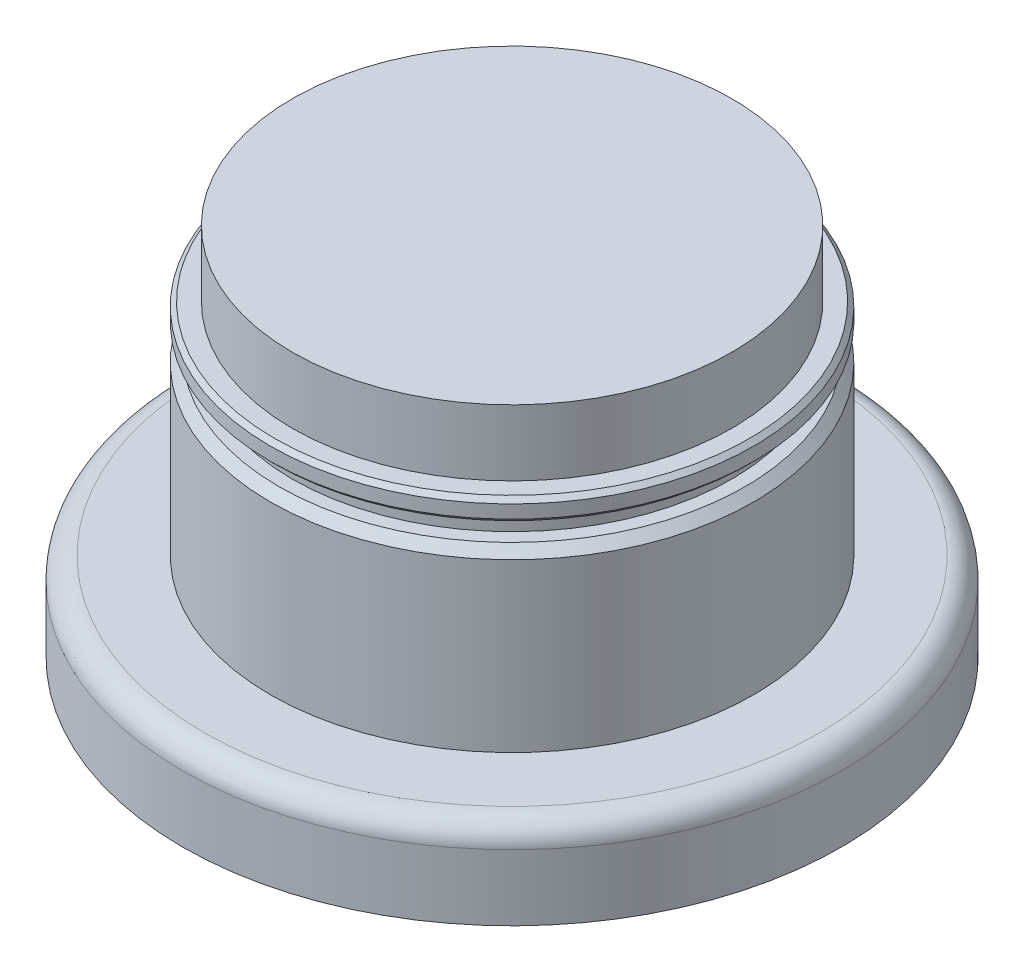
ISO-10303-21;
HEADER;
FILE_DESCRIPTION(('STEP AP214'),'2;1');
FILE_NAME('part.step','',(''),(''),'','','');
FILE_SCHEMA(('AUTOMOTIVE_DESIGN { 1 0 10303 214 1 1 1 1 }'));
ENDSEC;
DATA;
#1=APPLICATION_CONTEXT('core data for automotive mechanical design processes');
#2=APPLICATION_PROTOCOL_DEFINITION('international standard','automotive_design',2000,#1);
#3=PRODUCT_CONTEXT('',#1,'mechanical');
#4=PRODUCT('Part','Part','',(#3));
#5=PRODUCT_RELATED_PRODUCT_CATEGORY('part','',(#4));
#6=PRODUCT_DEFINITION_FORMATION('','',#4);
#7=PRODUCT_DEFINITION_CONTEXT('part definition',#1,'design');
#8=PRODUCT_DEFINITION('design','',#6,#7);
#9=PRODUCT_DEFINITION_SHAPE('','',#8);
#10=(LENGTH_UNIT() NAMED_UNIT(*) SI_UNIT(.MILLI.,.METRE.));
#11=(NAMED_UNIT(*) PLANE_ANGLE_UNIT() SI_UNIT($,.RADIAN.));
#12=(NAMED_UNIT(*) SI_UNIT($,.STERADIAN.) SOLID_ANGLE_UNIT());
#13=UNCERTAINTY_MEASURE_WITH_UNIT(LENGTH_MEASURE(1.E-05),#10,'distance_accuracy_value','');
#14=(GEOMETRIC_REPRESENTATION_CONTEXT(3) GLOBAL_UNCERTAINTY_ASSIGNED_CONTEXT((#13)) GLOBAL_UNIT_ASSIGNED_CONTEXT((#10,
#11,#12)) REPRESENTATION_CONTEXT('',''));
#15=CARTESIAN_POINT('',(0.,0.,0.));
#16=DIRECTION('',(0.,0.,1.));
#17=DIRECTION('',(1.,0.,0.));
#18=AXIS2_PLACEMENT_3D('',#15,#16,#17);
#19=CARTESIAN_POINT('',(0.,20.,0.));
#20=DIRECTION('',(0.,-1.,0.));
#21=DIRECTION('',(0.,0.,-1.));
#22=AXIS2_PLACEMENT_3D('',#19,#20,#21);
#23=CYLINDRICAL_SURFACE('',#22,75.);
#24=CARTESIAN_POINT('',(0.,15.,0.));
#25=DIRECTION('',(0.,1.,0.));
#26=DIRECTION('',(0.,0.,1.));
#27=AXIS2_PLACEMENT_3D('',#24,#25,#26);
#28=CIRCLE('',#27,75.);
#29=CARTESIAN_POINT('',(0.,15.,75.));
#30=VERTEX_POINT('',#29);
#31=EDGE_CURVE('E77',#30,#30,#28,.F.);
#32=ORIENTED_EDGE('',*,*,#31,.T.);
#33=EDGE_LOOP('',(#32));
#34=FACE_BOUND('',#33,.T.);
#35=CARTESIAN_POINT('',(0.,0.,0.));
#36=DIRECTION('',(0.,1.,0.));
#37=DIRECTION('',(0.,0.,1.));
#38=AXIS2_PLACEMENT_3D('',#35,#36,#37);
#39=CIRCLE('',#38,75.);
#40=CARTESIAN_POINT('',(0.,0.,75.));
#41=VERTEX_POINT('',#40);
#42=EDGE_CURVE('E86',#41,#41,#39,.T.);
#43=ORIENTED_EDGE('',*,*,#42,.T.);
#44=EDGE_LOOP('',(#43));
#45=FACE_BOUND('',#44,.T.);
#46=ADVANCED_FACE('F43',(#34,#45),#23,.T.);
#47=CARTESIAN_POINT('',(0.,20.,0.));
#48=DIRECTION('',(0.,1.,0.));
#49=DIRECTION('',(0.,0.,1.));
#50=AXIS2_PLACEMENT_3D('',#47,#48,#49);
#51=PLANE('',#50);
#52=CARTESIAN_POINT('',(0.,20.,0.));
#53=DIRECTION('',(0.,1.,0.));
#54=DIRECTION('',(0.,0.,1.));
#55=AXIS2_PLACEMENT_3D('',#52,#53,#54);
#56=CIRCLE('',#55,55.);
#57=CARTESIAN_POINT('',(0.,20.,55.));
#58=VERTEX_POINT('',#57);
#59=EDGE_CURVE('E90',#58,#58,#56,.T.);
#60=ORIENTED_EDGE('',*,*,#59,.F.);
#61=EDGE_LOOP('',(#60));
#62=FACE_BOUND('',#61,.T.);
#63=CARTESIAN_POINT('',(0.,20.,0.));
#64=DIRECTION('',(0.,1.,0.));
#65=DIRECTION('',(0.,0.,1.));
#66=AXIS2_PLACEMENT_3D('',#63,#64,#65);
#67=CIRCLE('',#66,70.);
#68=CARTESIAN_POINT('',(0.,20.,70.));
#69=VERTEX_POINT('',#68);
#70=EDGE_CURVE('E82',#69,#69,#67,.T.);
#71=ORIENTED_EDGE('',*,*,#70,.T.);
#72=EDGE_LOOP('',(#71));
#73=FACE_BOUND('',#72,.T.);
#74=ADVANCED_FACE('F133',(#62,#73),#51,.T.);
#75=CARTESIAN_POINT('',(0.,0.,0.));
#76=DIRECTION('',(0.,1.,0.));
#77=DIRECTION('',(0.,0.,1.));
#78=AXIS2_PLACEMENT_3D('',#75,#76,#77);
#79=PLANE('',#78);
#80=ORIENTED_EDGE('',*,*,#42,.F.);
#81=EDGE_LOOP('',(#80));
#82=FACE_BOUND('',#81,.T.);
#83=ADVANCED_FACE('F139',(#82),#79,.F.);
#84=CARTESIAN_POINT('',(0.,15.,0.));
#85=DIRECTION('',(0.,1.,0.));
#86=DIRECTION('',(0.,0.,1.));
#87=AXIS2_PLACEMENT_3D('',#84,#85,#86);
#88=TOROIDAL_SURFACE('',#87,70.,5.);
#89=ORIENTED_EDGE('',*,*,#31,.F.);
#90=EDGE_LOOP('',(#89));
#91=FACE_BOUND('',#90,.T.);
#92=ORIENTED_EDGE('',*,*,#70,.F.);
#93=EDGE_LOOP('',(#92));
#94=FACE_BOUND('',#93,.T.);
#95=ADVANCED_FACE('F145',(#91,#94),#88,.T.);
#96=CARTESIAN_POINT('',(0.,60.,0.));
#97=DIRECTION('',(0.,-1.,0.));
#98=DIRECTION('',(0.,0.,-1.));
#99=AXIS2_PLACEMENT_3D('',#96,#97,#98);
#100=CYLINDRICAL_SURFACE('',#99,55.);
#101=CARTESIAN_POINT('',(0.,58.,0.));
#102=DIRECTION('',(0.,1.,0.));
#103=DIRECTION('',(0.,0.,1.));
#104=AXIS2_PLACEMENT_3D('',#101,#102,#103);
#105=CIRCLE('',#104,55.);
#106=CARTESIAN_POINT('',(0.,58.,55.));
#107=VERTEX_POINT('',#106);
#108=EDGE_CURVE('E10',#107,#107,#105,.F.);
#109=ORIENTED_EDGE('',*,*,#108,.T.);
#110=EDGE_LOOP('',(#109));
#111=FACE_BOUND('',#110,.T.);
#112=ORIENTED_EDGE('',*,*,#59,.T.);
#113=EDGE_LOOP('',(#112));
#114=FACE_BOUND('',#113,.T.);
#115=ADVANCED_FACE('F148',(#111,#114),#100,.T.);
#116=CARTESIAN_POINT('',(0.,60.,0.));
#117=DIRECTION('',(0.,1.,0.));
#118=DIRECTION('',(0.,0.,1.));
#119=AXIS2_PLACEMENT_3D('',#116,#117,#118);
#120=PLANE('',#119);
#121=CARTESIAN_POINT('',(0.,60.,0.));
#122=DIRECTION('',(0.,1.,0.));
#123=DIRECTION('',(0.,0.,1.));
#124=AXIS2_PLACEMENT_3D('',#121,#122,#123);
#125=CIRCLE('',#124,53.);
#126=CARTESIAN_POINT('',(0.,60.,53.));
#127=VERTEX_POINT('',#126);
#128=EDGE_CURVE('E52',#127,#127,#125,.T.);
#129=ORIENTED_EDGE('',*,*,#128,.T.);
#130=EDGE_LOOP('',(#129));
#131=FACE_BOUND('',#130,.T.);
#132=CARTESIAN_POINT('',(0.,60.,0.));
#133=DIRECTION('',(0.,1.,0.));
#134=DIRECTION('',(0.,0.,1.));
#135=AXIS2_PLACEMENT_3D('',#132,#133,#134);
#136=CIRCLE('',#135,50.);
#137=CARTESIAN_POINT('',(0.,60.,50.));
#138=VERTEX_POINT('',#137);
#139=EDGE_CURVE('E81',#138,#138,#136,.T.);
#140=ORIENTED_EDGE('',*,*,#139,.F.);
#141=EDGE_LOOP('',(#140));
#142=FACE_BOUND('',#141,.T.);
#143=ADVANCED_FACE('F180',(#131,#142),#120,.T.);
#144=CARTESIAN_POINT('',(0.,65.,0.));
#145=DIRECTION('',(0.,-1.,0.));
#146=DIRECTION('',(0.,0.,-1.));
#147=AXIS2_PLACEMENT_3D('',#144,#145,#146);
#148=CYLINDRICAL_SURFACE('',#147,50.);
#149=CARTESIAN_POINT('',(0.,65.,0.));
#150=DIRECTION('',(0.,1.,0.));
#151=DIRECTION('',(0.,0.,1.));
#152=AXIS2_PLACEMENT_3D('',#149,#150,#151);
#153=CIRCLE('',#152,50.);
#154=CARTESIAN_POINT('',(0.,65.,50.));
#155=VERTEX_POINT('',#154);
#156=EDGE_CURVE('E94',#155,#155,#153,.T.);
#157=ORIENTED_EDGE('',*,*,#156,.F.);
#158=EDGE_LOOP('',(#157));
#159=FACE_BOUND('',#158,.T.);
#160=ORIENTED_EDGE('',*,*,#139,.T.);
#161=EDGE_LOOP('',(#160));
#162=FACE_BOUND('',#161,.T.);
#163=ADVANCED_FACE('F129',(#159,#162),#148,.T.);
#164=CARTESIAN_POINT('',(0.,70.,0.));
#165=DIRECTION('',(0.,-1.,0.));
#166=DIRECTION('',(0.,0.,-1.));
#167=AXIS2_PLACEMENT_3D('',#164,#165,#166);
#168=CYLINDRICAL_SURFACE('',#167,55.);
#169=CARTESIAN_POINT('',(0.,66.,0.));
#170=DIRECTION('',(0.,1.,0.));
#171=DIRECTION('',(0.,0.,1.));
#172=AXIS2_PLACEMENT_3D('',#169,#170,#171);
#173=CIRCLE('',#172,55.);
#174=CARTESIAN_POINT('',(0.,66.,55.));
#175=VERTEX_POINT('',#174);
#176=EDGE_CURVE('E68',#175,#175,#173,.T.);
#177=ORIENTED_EDGE('',*,*,#176,.T.);
#178=EDGE_LOOP('',(#177));
#179=FACE_BOUND('',#178,.T.);
#180=CARTESIAN_POINT('',(0.,69.,0.));
#181=DIRECTION('',(0.,1.,0.));
#182=DIRECTION('',(0.,0.,1.));
#183=AXIS2_PLACEMENT_3D('',#180,#181,#182);
#184=CIRCLE('',#183,55.);
#185=CARTESIAN_POINT('',(0.,69.,55.));
#186=VERTEX_POINT('',#185);
#187=EDGE_CURVE('E72',#186,#186,#184,.F.);
#188=ORIENTED_EDGE('',*,*,#187,.T.);
#189=EDGE_LOOP('',(#188));
#190=FACE_BOUND('',#189,.T.);
#191=ADVANCED_FACE('F120',(#179,#190),#168,.T.);
#192=CARTESIAN_POINT('',(0.,70.,0.));
#193=DIRECTION('',(0.,1.,0.));
#194=DIRECTION('',(0.,0.,1.));
#195=AXIS2_PLACEMENT_3D('',#192,#193,#194);
#196=PLANE('',#195);
#197=CARTESIAN_POINT('',(0.,70.,0.));
#198=DIRECTION('',(0.,1.,0.));
#199=DIRECTION('',(0.,0.,1.));
#200=AXIS2_PLACEMENT_3D('',#197,#198,#199);
#201=CIRCLE('',#200,54.);
#202=CARTESIAN_POINT('',(0.,70.,54.));
#203=VERTEX_POINT('',#202);
#204=EDGE_CURVE('E57',#203,#203,#201,.T.);
#205=ORIENTED_EDGE('',*,*,#204,.T.);
#206=EDGE_LOOP('',(#205));
#207=FACE_BOUND('',#206,.T.);
#208=CARTESIAN_POINT('',(0.,70.,0.));
#209=DIRECTION('',(0.,1.,0.));
#210=DIRECTION('',(0.,0.,1.));
#211=AXIS2_PLACEMENT_3D('',#208,#209,#210);
#212=CIRCLE('',#211,50.);
#213=CARTESIAN_POINT('',(0.,70.,50.));
#214=VERTEX_POINT('',#213);
#215=EDGE_CURVE('E76',#214,#214,#212,.T.);
#216=ORIENTED_EDGE('',*,*,#215,.F.);
#217=EDGE_LOOP('',(#216));
#218=FACE_BOUND('',#217,.T.);
#219=ADVANCED_FACE('F118',(#207,#218),#196,.T.);
#220=CARTESIAN_POINT('',(0.,65.,0.));
#221=DIRECTION('',(0.,1.,0.));
#222=DIRECTION('',(0.,0.,1.));
#223=AXIS2_PLACEMENT_3D('',#220,#221,#222);
#224=PLANE('',#223);
#225=CARTESIAN_POINT('',(0.,65.,0.));
#226=DIRECTION('',(0.,1.,0.));
#227=DIRECTION('',(0.,0.,1.));
#228=AXIS2_PLACEMENT_3D('',#225,#226,#227);
#229=CIRCLE('',#228,54.);
#230=CARTESIAN_POINT('',(0.,65.,54.));
#231=VERTEX_POINT('',#230);
#232=EDGE_CURVE('E62',#231,#231,#229,.F.);
#233=ORIENTED_EDGE('',*,*,#232,.T.);
#234=EDGE_LOOP('',(#233));
#235=FACE_BOUND('',#234,.T.);
#236=ORIENTED_EDGE('',*,*,#156,.T.);
#237=EDGE_LOOP('',(#236));
#238=FACE_BOUND('',#237,.T.);
#239=ADVANCED_FACE('F114',(#235,#238),#224,.F.);
#240=CARTESIAN_POINT('',(0.,85.,0.));
#241=DIRECTION('',(0.,-1.,0.));
#242=DIRECTION('',(0.,0.,-1.));
#243=AXIS2_PLACEMENT_3D('',#240,#241,#242);
#244=CYLINDRICAL_SURFACE('',#243,50.);
#245=CARTESIAN_POINT('',(0.,85.,0.));
#246=DIRECTION('',(0.,1.,0.));
#247=DIRECTION('',(0.,0.,1.));
#248=AXIS2_PLACEMENT_3D('',#245,#246,#247);
#249=CIRCLE('',#248,50.);
#250=CARTESIAN_POINT('',(0.,85.,50.));
#251=VERTEX_POINT('',#250);
#252=EDGE_CURVE('E101',#251,#251,#249,.T.);
#253=ORIENTED_EDGE('',*,*,#252,.F.);
#254=EDGE_LOOP('',(#253));
#255=FACE_BOUND('',#254,.T.);
#256=ORIENTED_EDGE('',*,*,#215,.T.);
#257=EDGE_LOOP('',(#256));
#258=FACE_BOUND('',#257,.T.);
#259=ADVANCED_FACE('F111',(#255,#258),#244,.T.);
#260=CARTESIAN_POINT('',(0.,85.,0.));
#261=DIRECTION('',(0.,1.,0.));
#262=DIRECTION('',(0.,0.,1.));
#263=AXIS2_PLACEMENT_3D('',#260,#261,#262);
#264=PLANE('',#263);
#265=ORIENTED_EDGE('',*,*,#252,.T.);
#266=EDGE_LOOP('',(#265));
#267=FACE_BOUND('',#266,.T.);
#268=ADVANCED_FACE('F109',(#267),#264,.T.);
#269=CARTESIAN_POINT('',(0.,66.,0.));
#270=DIRECTION('',(0.,1.,0.));
#271=DIRECTION('',(0.,0.,1.));
#272=AXIS2_PLACEMENT_3D('',#269,#270,#271);
#273=CONICAL_SURFACE('',#272,55.,0.785398163397445);
#274=ORIENTED_EDGE('',*,*,#232,.F.);
#275=EDGE_LOOP('',(#274));
#276=FACE_BOUND('',#275,.T.);
#277=ORIENTED_EDGE('',*,*,#176,.F.);
#278=EDGE_LOOP('',(#277));
#279=FACE_BOUND('',#278,.T.);
#280=ADVANCED_FACE('F151',(#276,#279),#273,.T.);
#281=CARTESIAN_POINT('',(0.,70.,0.));
#282=DIRECTION('',(0.,-1.,0.));
#283=DIRECTION('',(0.,0.,-1.));
#284=AXIS2_PLACEMENT_3D('',#281,#282,#283);
#285=CONICAL_SURFACE('',#284,54.,0.785398163397455);
#286=ORIENTED_EDGE('',*,*,#187,.F.);
#287=EDGE_LOOP('',(#286));
#288=FACE_BOUND('',#287,.T.);
#289=ORIENTED_EDGE('',*,*,#204,.F.);
#290=EDGE_LOOP('',(#289));
#291=FACE_BOUND('',#290,.T.);
#292=ADVANCED_FACE('F156',(#288,#291),#285,.T.);
#293=CARTESIAN_POINT('',(0.,60.,0.));
#294=DIRECTION('',(0.,-1.,0.));
#295=DIRECTION('',(0.,0.,-1.));
#296=AXIS2_PLACEMENT_3D('',#293,#294,#295);
#297=CONICAL_SURFACE('',#296,53.,0.78539816339745);
#298=ORIENTED_EDGE('',*,*,#108,.F.);
#299=EDGE_LOOP('',(#298));
#300=FACE_BOUND('',#299,.T.);
#301=ORIENTED_EDGE('',*,*,#128,.F.);
#302=EDGE_LOOP('',(#301));
#303=FACE_BOUND('',#302,.T.);
#304=ADVANCED_FACE('F46',(#300,#303),#297,.T.);
#305=CLOSED_SHELL('',(#46,#74,#83,#95,#115,#143,#163,#191,#219,#239,#259,#268,#280,#292,#304));
#306=MANIFOLD_SOLID_BREP('B2',#305);
#307=ADVANCED_BREP_SHAPE_REPRESENTATION('',(#18,#306),#14);
#308=SHAPE_DEFINITION_REPRESENTATION(#9,#307);
ENDSEC;
END-ISO-10303-21;
